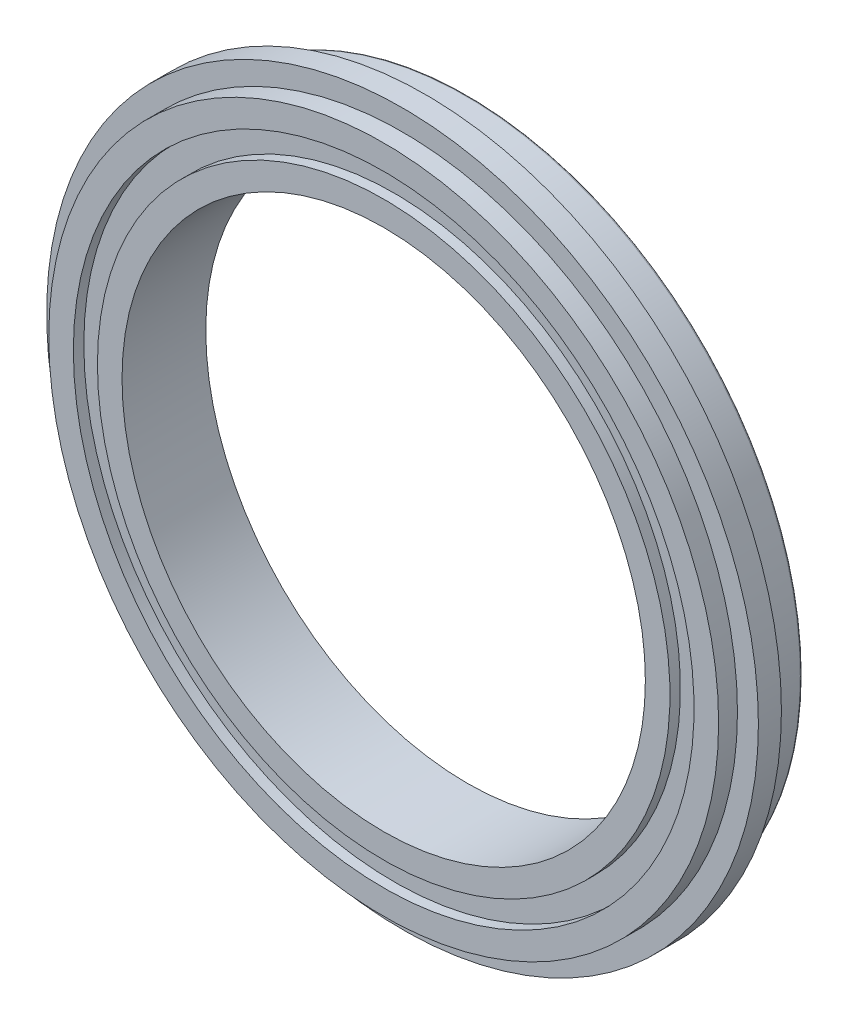
ISO-10303-21;
HEADER;
FILE_DESCRIPTION(('STEP AP214'),'2;1');
FILE_NAME('part.step','',(''),(''),'','','');
FILE_SCHEMA(('AUTOMOTIVE_DESIGN { 1 0 10303 214 1 1 1 1 }'));
ENDSEC;
DATA;
#1=APPLICATION_CONTEXT('core data for automotive mechanical design processes');
#2=APPLICATION_PROTOCOL_DEFINITION('international standard','automotive_design',2000,#1);
#3=PRODUCT_CONTEXT('',#1,'mechanical');
#4=PRODUCT('Part','Part','',(#3));
#5=PRODUCT_RELATED_PRODUCT_CATEGORY('part','',(#4));
#6=PRODUCT_DEFINITION_FORMATION('','',#4);
#7=PRODUCT_DEFINITION_CONTEXT('part definition',#1,'design');
#8=PRODUCT_DEFINITION('design','',#6,#7);
#9=PRODUCT_DEFINITION_SHAPE('','',#8);
#10=(LENGTH_UNIT() NAMED_UNIT(*) SI_UNIT(.MILLI.,.METRE.));
#11=(NAMED_UNIT(*) PLANE_ANGLE_UNIT() SI_UNIT($,.RADIAN.));
#12=(NAMED_UNIT(*) SI_UNIT($,.STERADIAN.) SOLID_ANGLE_UNIT());
#13=UNCERTAINTY_MEASURE_WITH_UNIT(LENGTH_MEASURE(1.E-05),#10,'distance_accuracy_value','');
#14=(GEOMETRIC_REPRESENTATION_CONTEXT(3) GLOBAL_UNCERTAINTY_ASSIGNED_CONTEXT((#13)) GLOBAL_UNIT_ASSIGNED_CONTEXT((#10,
#11,#12)) REPRESENTATION_CONTEXT('',''));
#15=CARTESIAN_POINT('',(0.,0.,0.));
#16=DIRECTION('',(0.,0.,1.));
#17=DIRECTION('',(1.,0.,0.));
#18=AXIS2_PLACEMENT_3D('',#15,#16,#17);
#19=CARTESIAN_POINT('',(0.,0.,4.));
#20=DIRECTION('',(0.,0.,1.));
#21=DIRECTION('',(1.,0.,0.));
#22=AXIS2_PLACEMENT_3D('',#19,#20,#21);
#23=PLANE('',#22);
#24=CARTESIAN_POINT('',(0.,0.,4.));
#25=DIRECTION('',(0.,0.,-1.));
#26=DIRECTION('',(-1.,0.,0.));
#27=AXIS2_PLACEMENT_3D('',#24,#25,#26);
#28=CIRCLE('',#27,13.675);
#29=CARTESIAN_POINT('',(-13.675,0.,4.));
#30=VERTEX_POINT('',#29);
#31=EDGE_CURVE('E81',#30,#30,#28,.T.);
#32=ORIENTED_EDGE('',*,*,#31,.F.);
#33=EDGE_LOOP('',(#32));
#34=FACE_BOUND('',#33,.T.);
#35=CARTESIAN_POINT('',(0.,0.,4.));
#36=DIRECTION('',(0.,0.,1.));
#37=DIRECTION('',(1.,0.,0.));
#38=AXIS2_PLACEMENT_3D('',#35,#36,#37);
#39=CIRCLE('',#38,12.5);
#40=CARTESIAN_POINT('',(12.5,0.,4.));
#41=VERTEX_POINT('',#40);
#42=EDGE_CURVE('E52',#41,#41,#39,.T.);
#43=ORIENTED_EDGE('',*,*,#42,.F.);
#44=EDGE_LOOP('',(#43));
#45=FACE_BOUND('',#44,.T.);
#46=ADVANCED_FACE('F32',(#34,#45),#23,.T.);
#47=CARTESIAN_POINT('',(0.,0.,0.));
#48=DIRECTION('',(0.,0.,1.));
#49=DIRECTION('',(1.,0.,0.));
#50=AXIS2_PLACEMENT_3D('',#47,#48,#49);
#51=PLANE('',#50);
#52=CARTESIAN_POINT('',(0.,0.,0.));
#53=DIRECTION('',(0.,0.,-1.));
#54=DIRECTION('',(-1.,0.,0.));
#55=AXIS2_PLACEMENT_3D('',#52,#53,#54);
#56=CIRCLE('',#55,13.675);
#57=CARTESIAN_POINT('',(-13.675,0.,0.));
#58=VERTEX_POINT('',#57);
#59=EDGE_CURVE('E67',#58,#58,#56,.T.);
#60=ORIENTED_EDGE('',*,*,#59,.T.);
#61=EDGE_LOOP('',(#60));
#62=FACE_BOUND('',#61,.T.);
#63=CARTESIAN_POINT('',(0.,0.,0.));
#64=DIRECTION('',(0.,0.,1.));
#65=DIRECTION('',(1.,0.,0.));
#66=AXIS2_PLACEMENT_3D('',#63,#64,#65);
#67=CIRCLE('',#66,12.5);
#68=CARTESIAN_POINT('',(12.5,0.,0.));
#69=VERTEX_POINT('',#68);
#70=EDGE_CURVE('E53',#69,#69,#67,.T.);
#71=ORIENTED_EDGE('',*,*,#70,.T.);
#72=EDGE_LOOP('',(#71));
#73=FACE_BOUND('',#72,.T.);
#74=ADVANCED_FACE('F132',(#62,#73),#51,.F.);
#75=CARTESIAN_POINT('',(0.,0.,4.));
#76=DIRECTION('',(0.,0.,-1.));
#77=DIRECTION('',(-1.,0.,0.));
#78=AXIS2_PLACEMENT_3D('',#75,#76,#77);
#79=CYLINDRICAL_SURFACE('',#78,16.);
#80=CARTESIAN_POINT('',(0.,0.,0.0999999999999998));
#81=DIRECTION('',(0.,0.,1.));
#82=DIRECTION('',(1.,0.,0.));
#83=AXIS2_PLACEMENT_3D('',#80,#81,#82);
#84=CIRCLE('',#83,16.);
#85=CARTESIAN_POINT('',(16.,0.,0.0999999999999998));
#86=VERTEX_POINT('',#85);
#87=EDGE_CURVE('E39',#86,#86,#84,.T.);
#88=ORIENTED_EDGE('',*,*,#87,.T.);
#89=EDGE_LOOP('',(#88));
#90=FACE_BOUND('',#89,.T.);
#91=CARTESIAN_POINT('',(0.,0.,2.));
#92=DIRECTION('',(0.,0.,1.));
#93=DIRECTION('',(1.,0.,0.));
#94=AXIS2_PLACEMENT_3D('',#91,#92,#93);
#95=CIRCLE('',#94,16.);
#96=CARTESIAN_POINT('',(16.,0.,2.));
#97=VERTEX_POINT('',#96);
#98=EDGE_CURVE('E43',#97,#97,#95,.T.);
#99=ORIENTED_EDGE('',*,*,#98,.F.);
#100=EDGE_LOOP('',(#99));
#101=FACE_BOUND('',#100,.T.);
#102=ADVANCED_FACE('F138',(#90,#101),#79,.T.);
#103=CARTESIAN_POINT('',(0.,0.,4.));
#104=DIRECTION('',(0.,0.,-1.));
#105=DIRECTION('',(-1.,0.,0.));
#106=AXIS2_PLACEMENT_3D('',#103,#104,#105);
#107=CIRCLE('',#106,14.825);
#108=CARTESIAN_POINT('',(-14.825,0.,4.));
#109=VERTEX_POINT('',#108);
#110=EDGE_CURVE('E95',#109,#109,#107,.T.);
#111=ORIENTED_EDGE('',*,*,#110,.T.);
#112=EDGE_LOOP('',(#111));
#113=FACE_BOUND('',#112,.T.);
#114=CARTESIAN_POINT('',(0.,0.,4.));
#115=DIRECTION('',(0.,0.,1.));
#116=DIRECTION('',(1.,0.,0.));
#117=AXIS2_PLACEMENT_3D('',#114,#115,#116);
#118=CIRCLE('',#117,16.);
#119=CARTESIAN_POINT('',(16.,0.,4.));
#120=VERTEX_POINT('',#119);
#121=EDGE_CURVE('E47',#120,#120,#118,.T.);
#122=ORIENTED_EDGE('',*,*,#121,.T.);
#123=EDGE_LOOP('',(#122));
#124=FACE_BOUND('',#123,.T.);
#125=ADVANCED_FACE('F116',(#113,#124),#23,.T.);
#126=CARTESIAN_POINT('',(0.,0.,0.));
#127=DIRECTION('',(0.,0.,-1.));
#128=DIRECTION('',(-1.,0.,0.));
#129=AXIS2_PLACEMENT_3D('',#126,#127,#128);
#130=CIRCLE('',#129,14.825);
#131=CARTESIAN_POINT('',(-14.825,0.,0.));
#132=VERTEX_POINT('',#131);
#133=EDGE_CURVE('E71',#132,#132,#130,.T.);
#134=ORIENTED_EDGE('',*,*,#133,.F.);
#135=EDGE_LOOP('',(#134));
#136=FACE_BOUND('',#135,.T.);
#137=CARTESIAN_POINT('',(0.,0.,0.));
#138=DIRECTION('',(0.,0.,1.));
#139=DIRECTION('',(1.,0.,0.));
#140=AXIS2_PLACEMENT_3D('',#137,#138,#139);
#141=CIRCLE('',#140,15.9);
#142=CARTESIAN_POINT('',(15.9,0.,0.));
#143=VERTEX_POINT('',#142);
#144=EDGE_CURVE('E10',#143,#143,#141,.F.);
#145=ORIENTED_EDGE('',*,*,#144,.T.);
#146=EDGE_LOOP('',(#145));
#147=FACE_BOUND('',#146,.T.);
#148=ADVANCED_FACE('F141',(#136,#147),#51,.F.);
#149=CARTESIAN_POINT('',(0.,0.,3.1));
#150=DIRECTION('',(0.,0.,1.));
#151=DIRECTION('',(1.,0.,0.));
#152=AXIS2_PLACEMENT_3D('',#149,#150,#151);
#153=CIRCLE('',#152,16.);
#154=CARTESIAN_POINT('',(16.,0.,3.1));
#155=VERTEX_POINT('',#154);
#156=EDGE_CURVE('E62',#155,#155,#153,.T.);
#157=ORIENTED_EDGE('',*,*,#156,.T.);
#158=EDGE_LOOP('',(#157));
#159=FACE_BOUND('',#158,.T.);
#160=ORIENTED_EDGE('',*,*,#121,.F.);
#161=EDGE_LOOP('',(#160));
#162=FACE_BOUND('',#161,.T.);
#163=ADVANCED_FACE('F150',(#159,#162),#79,.T.);
#164=CARTESIAN_POINT('',(0.,0.,4.));
#165=DIRECTION('',(0.,0.,-1.));
#166=DIRECTION('',(-1.,0.,0.));
#167=AXIS2_PLACEMENT_3D('',#164,#165,#166);
#168=CYLINDRICAL_SURFACE('',#167,12.5);
#169=ORIENTED_EDGE('',*,*,#42,.T.);
#170=EDGE_LOOP('',(#169));
#171=FACE_BOUND('',#170,.T.);
#172=ORIENTED_EDGE('',*,*,#70,.F.);
#173=EDGE_LOOP('',(#172));
#174=FACE_BOUND('',#173,.T.);
#175=ADVANCED_FACE('F156',(#171,#174),#168,.F.);
#176=CARTESIAN_POINT('',(0.,0.,2.));
#177=DIRECTION('',(0.,0.,1.));
#178=DIRECTION('',(1.,0.,0.));
#179=AXIS2_PLACEMENT_3D('',#176,#177,#178);
#180=CYLINDRICAL_SURFACE('',#179,17.);
#181=CARTESIAN_POINT('',(0.,0.,2.));
#182=DIRECTION('',(0.,0.,1.));
#183=DIRECTION('',(1.,0.,0.));
#184=AXIS2_PLACEMENT_3D('',#181,#182,#183);
#185=CIRCLE('',#184,17.);
#186=CARTESIAN_POINT('',(17.,0.,2.));
#187=VERTEX_POINT('',#186);
#188=EDGE_CURVE('E56',#187,#187,#185,.T.);
#189=ORIENTED_EDGE('',*,*,#188,.T.);
#190=EDGE_LOOP('',(#189));
#191=FACE_BOUND('',#190,.T.);
#192=CARTESIAN_POINT('',(0.,0.,3.1));
#193=DIRECTION('',(0.,0.,1.));
#194=DIRECTION('',(1.,0.,0.));
#195=AXIS2_PLACEMENT_3D('',#192,#193,#194);
#196=CIRCLE('',#195,17.);
#197=CARTESIAN_POINT('',(17.,0.,3.1));
#198=VERTEX_POINT('',#197);
#199=EDGE_CURVE('E59',#198,#198,#196,.T.);
#200=ORIENTED_EDGE('',*,*,#199,.F.);
#201=EDGE_LOOP('',(#200));
#202=FACE_BOUND('',#201,.T.);
#203=ADVANCED_FACE('F161',(#191,#202),#180,.T.);
#204=CARTESIAN_POINT('',(0.,0.,2.));
#205=DIRECTION('',(0.,0.,1.));
#206=DIRECTION('',(1.,0.,0.));
#207=AXIS2_PLACEMENT_3D('',#204,#205,#206);
#208=PLANE('',#207);
#209=ORIENTED_EDGE('',*,*,#98,.T.);
#210=EDGE_LOOP('',(#209));
#211=FACE_BOUND('',#210,.T.);
#212=ORIENTED_EDGE('',*,*,#188,.F.);
#213=EDGE_LOOP('',(#212));
#214=FACE_BOUND('',#213,.T.);
#215=ADVANCED_FACE('F170',(#211,#214),#208,.F.);
#216=CARTESIAN_POINT('',(0.,0.,3.1));
#217=DIRECTION('',(0.,0.,1.));
#218=DIRECTION('',(1.,0.,0.));
#219=AXIS2_PLACEMENT_3D('',#216,#217,#218);
#220=PLANE('',#219);
#221=ORIENTED_EDGE('',*,*,#156,.F.);
#222=EDGE_LOOP('',(#221));
#223=FACE_BOUND('',#222,.T.);
#224=ORIENTED_EDGE('',*,*,#199,.T.);
#225=EDGE_LOOP('',(#224));
#226=FACE_BOUND('',#225,.T.);
#227=ADVANCED_FACE('F167',(#223,#226),#220,.T.);
#228=CARTESIAN_POINT('',(0.,0.,0.0999999999999998));
#229=DIRECTION('',(0.,0.,1.));
#230=DIRECTION('',(1.,0.,0.));
#231=AXIS2_PLACEMENT_3D('',#228,#229,#230);
#232=TOROIDAL_SURFACE('',#231,15.9,0.1);
#233=ORIENTED_EDGE('',*,*,#144,.F.);
#234=EDGE_LOOP('',(#233));
#235=FACE_BOUND('',#234,.T.);
#236=ORIENTED_EDGE('',*,*,#87,.F.);
#237=EDGE_LOOP('',(#236));
#238=FACE_BOUND('',#237,.T.);
#239=ADVANCED_FACE('F34',(#235,#238),#232,.T.);
#240=CARTESIAN_POINT('',(0.,0.,0.));
#241=DIRECTION('',(0.,0.,-1.));
#242=DIRECTION('',(-1.,0.,0.));
#243=AXIS2_PLACEMENT_3D('',#240,#241,#242);
#244=CYLINDRICAL_SURFACE('',#243,13.675);
#245=ORIENTED_EDGE('',*,*,#59,.F.);
#246=EDGE_LOOP('',(#245));
#247=FACE_BOUND('',#246,.T.);
#248=CARTESIAN_POINT('',(0.,0.,0.5));
#249=DIRECTION('',(0.,0.,-1.));
#250=DIRECTION('',(-1.,0.,0.));
#251=AXIS2_PLACEMENT_3D('',#248,#249,#250);
#252=CIRCLE('',#251,13.675);
#253=CARTESIAN_POINT('',(-13.675,0.,0.5));
#254=VERTEX_POINT('',#253);
#255=EDGE_CURVE('E84',#254,#254,#252,.T.);
#256=ORIENTED_EDGE('',*,*,#255,.T.);
#257=EDGE_LOOP('',(#256));
#258=FACE_BOUND('',#257,.T.);
#259=ADVANCED_FACE('F199',(#247,#258),#244,.T.);
#260=CARTESIAN_POINT('',(0.,13.675,0.5));
#261=DIRECTION('',(0.,0.,1.));
#262=DIRECTION('',(1.,0.,0.));
#263=AXIS2_PLACEMENT_3D('',#260,#261,#262);
#264=PLANE('',#263);
#265=ORIENTED_EDGE('',*,*,#255,.F.);
#266=EDGE_LOOP('',(#265));
#267=FACE_BOUND('',#266,.T.);
#268=CARTESIAN_POINT('',(0.,0.,0.5));
#269=DIRECTION('',(0.,0.,-1.));
#270=DIRECTION('',(-1.,0.,0.));
#271=AXIS2_PLACEMENT_3D('',#268,#269,#270);
#272=CIRCLE('',#271,14.825);
#273=CARTESIAN_POINT('',(-14.825,0.,0.5));
#274=VERTEX_POINT('',#273);
#275=EDGE_CURVE('E87',#274,#274,#272,.T.);
#276=ORIENTED_EDGE('',*,*,#275,.T.);
#277=EDGE_LOOP('',(#276));
#278=FACE_BOUND('',#277,.T.);
#279=ADVANCED_FACE('F202',(#267,#278),#264,.F.);
#280=CARTESIAN_POINT('',(0.,0.,0.));
#281=DIRECTION('',(0.,0.,-1.));
#282=DIRECTION('',(-1.,0.,0.));
#283=AXIS2_PLACEMENT_3D('',#280,#281,#282);
#284=CYLINDRICAL_SURFACE('',#283,14.825);
#285=ORIENTED_EDGE('',*,*,#275,.F.);
#286=EDGE_LOOP('',(#285));
#287=FACE_BOUND('',#286,.T.);
#288=ORIENTED_EDGE('',*,*,#133,.T.);
#289=EDGE_LOOP('',(#288));
#290=FACE_BOUND('',#289,.T.);
#291=ADVANCED_FACE('F206',(#287,#290),#284,.F.);
#292=CARTESIAN_POINT('',(0.,0.,4.));
#293=DIRECTION('',(0.,0.,1.));
#294=DIRECTION('',(-1.,0.,0.));
#295=AXIS2_PLACEMENT_3D('',#292,#293,#294);
#296=CYLINDRICAL_SURFACE('',#295,13.675);
#297=ORIENTED_EDGE('',*,*,#31,.T.);
#298=EDGE_LOOP('',(#297));
#299=FACE_BOUND('',#298,.T.);
#300=CARTESIAN_POINT('',(0.,0.,3.5));
#301=DIRECTION('',(0.,0.,-1.));
#302=DIRECTION('',(-1.,0.,0.));
#303=AXIS2_PLACEMENT_3D('',#300,#301,#302);
#304=CIRCLE('',#303,13.675);
#305=CARTESIAN_POINT('',(-13.675,0.,3.5));
#306=VERTEX_POINT('',#305);
#307=EDGE_CURVE('E107',#306,#306,#304,.T.);
#308=ORIENTED_EDGE('',*,*,#307,.F.);
#309=EDGE_LOOP('',(#308));
#310=FACE_BOUND('',#309,.T.);
#311=ADVANCED_FACE('F128',(#299,#310),#296,.T.);
#312=CARTESIAN_POINT('',(0.,13.675,3.5));
#313=DIRECTION('',(0.,0.,-1.));
#314=DIRECTION('',(1.,0.,0.));
#315=AXIS2_PLACEMENT_3D('',#312,#313,#314);
#316=PLANE('',#315);
#317=ORIENTED_EDGE('',*,*,#307,.T.);
#318=EDGE_LOOP('',(#317));
#319=FACE_BOUND('',#318,.T.);
#320=CARTESIAN_POINT('',(0.,0.,3.5));
#321=DIRECTION('',(0.,0.,-1.));
#322=DIRECTION('',(-1.,0.,0.));
#323=AXIS2_PLACEMENT_3D('',#320,#321,#322);
#324=CIRCLE('',#323,14.825);
#325=CARTESIAN_POINT('',(-14.825,0.,3.5));
#326=VERTEX_POINT('',#325);
#327=EDGE_CURVE('E110',#326,#326,#324,.T.);
#328=ORIENTED_EDGE('',*,*,#327,.F.);
#329=EDGE_LOOP('',(#328));
#330=FACE_BOUND('',#329,.T.);
#331=ADVANCED_FACE('F121',(#319,#330),#316,.F.);
#332=CARTESIAN_POINT('',(0.,0.,4.));
#333=DIRECTION('',(0.,0.,1.));
#334=DIRECTION('',(-1.,0.,0.));
#335=AXIS2_PLACEMENT_3D('',#332,#333,#334);
#336=CYLINDRICAL_SURFACE('',#335,14.825);
#337=ORIENTED_EDGE('',*,*,#327,.T.);
#338=EDGE_LOOP('',(#337));
#339=FACE_BOUND('',#338,.T.);
#340=ORIENTED_EDGE('',*,*,#110,.F.);
#341=EDGE_LOOP('',(#340));
#342=FACE_BOUND('',#341,.T.);
#343=ADVANCED_FACE('F119',(#339,#342),#336,.F.);
#344=CLOSED_SHELL('',(#46,#74,#102,#125,#148,#163,#175,#203,#215,#227,#239,#259,#279,#291,#311,
#331,#343));
#345=CARTESIAN_POINT('',(0.,13.675,3.1));
#346=DIRECTION('',(0.,0.,1.));
#347=DIRECTION('',(1.,0.,0.));
#348=AXIS2_PLACEMENT_3D('',#345,#346,#347);
#349=PLANE('',#348);
#350=CARTESIAN_POINT('',(0.,0.,3.1));
#351=DIRECTION('',(0.,0.,-1.));
#352=DIRECTION('',(-1.,0.,0.));
#353=AXIS2_PLACEMENT_3D('',#350,#351,#352);
#354=CIRCLE('',#353,13.675);
#355=CARTESIAN_POINT('',(-13.675,0.,3.1));
#356=VERTEX_POINT('',#355);
#357=EDGE_CURVE('E68',#356,#356,#354,.T.);
#358=ORIENTED_EDGE('',*,*,#357,.F.);
#359=EDGE_LOOP('',(#358));
#360=FACE_BOUND('',#359,.T.);
#361=CARTESIAN_POINT('',(0.,0.,3.1));
#362=DIRECTION('',(0.,0.,-1.));
#363=DIRECTION('',(-1.,0.,0.));
#364=AXIS2_PLACEMENT_3D('',#361,#362,#363);
#365=CIRCLE('',#364,14.825);
#366=CARTESIAN_POINT('',(-14.825,0.,3.1));
#367=VERTEX_POINT('',#366);
#368=EDGE_CURVE('E78',#367,#367,#365,.T.);
#369=ORIENTED_EDGE('',*,*,#368,.T.);
#370=EDGE_LOOP('',(#369));
#371=FACE_BOUND('',#370,.T.);
#372=ADVANCED_FACE('F183',(#360,#371),#349,.F.);
#373=CARTESIAN_POINT('',(0.,0.,0.));
#374=DIRECTION('',(0.,0.,-1.));
#375=DIRECTION('',(-1.,0.,0.));
#376=AXIS2_PLACEMENT_3D('',#373,#374,#375);
#377=CYLINDRICAL_SURFACE('',#376,13.675);
#378=CARTESIAN_POINT('',(0.,0.,2.6));
#379=DIRECTION('',(0.,0.,-1.));
#380=DIRECTION('',(-1.,0.,0.));
#381=AXIS2_PLACEMENT_3D('',#378,#379,#380);
#382=CIRCLE('',#381,13.675);
#383=CARTESIAN_POINT('',(-13.675,0.,2.6));
#384=VERTEX_POINT('',#383);
#385=EDGE_CURVE('E72',#384,#384,#382,.T.);
#386=ORIENTED_EDGE('',*,*,#385,.F.);
#387=EDGE_LOOP('',(#386));
#388=FACE_BOUND('',#387,.T.);
#389=ORIENTED_EDGE('',*,*,#357,.T.);
#390=EDGE_LOOP('',(#389));
#391=FACE_BOUND('',#390,.T.);
#392=ADVANCED_FACE('F185',(#388,#391),#377,.T.);
#393=CARTESIAN_POINT('',(0.,13.675,2.6));
#394=DIRECTION('',(0.,0.,-1.));
#395=DIRECTION('',(-1.,0.,0.));
#396=AXIS2_PLACEMENT_3D('',#393,#394,#395);
#397=PLANE('',#396);
#398=CARTESIAN_POINT('',(0.,0.,2.6));
#399=DIRECTION('',(0.,0.,-1.));
#400=DIRECTION('',(-1.,0.,0.));
#401=AXIS2_PLACEMENT_3D('',#398,#399,#400);
#402=CIRCLE('',#401,14.825);
#403=CARTESIAN_POINT('',(-14.825,0.,2.6));
#404=VERTEX_POINT('',#403);
#405=EDGE_CURVE('E75',#404,#404,#402,.T.);
#406=ORIENTED_EDGE('',*,*,#405,.F.);
#407=EDGE_LOOP('',(#406));
#408=FACE_BOUND('',#407,.T.);
#409=ORIENTED_EDGE('',*,*,#385,.T.);
#410=EDGE_LOOP('',(#409));
#411=FACE_BOUND('',#410,.T.);
#412=ADVANCED_FACE('F190',(#408,#411),#397,.F.);
#413=CARTESIAN_POINT('',(0.,0.,0.));
#414=DIRECTION('',(0.,0.,-1.));
#415=DIRECTION('',(-1.,0.,0.));
#416=AXIS2_PLACEMENT_3D('',#413,#414,#415);
#417=CYLINDRICAL_SURFACE('',#416,14.825);
#418=ORIENTED_EDGE('',*,*,#368,.F.);
#419=EDGE_LOOP('',(#418));
#420=FACE_BOUND('',#419,.T.);
#421=ORIENTED_EDGE('',*,*,#405,.T.);
#422=EDGE_LOOP('',(#421));
#423=FACE_BOUND('',#422,.T.);
#424=ADVANCED_FACE('F194',(#420,#423),#417,.F.);
#425=CLOSED_SHELL('',(#372,#392,#412,#424));
#426=CARTESIAN_POINT('',(0.,13.675,0.9));
#427=DIRECTION('',(0.,0.,-1.));
#428=DIRECTION('',(1.,0.,0.));
#429=AXIS2_PLACEMENT_3D('',#426,#427,#428);
#430=PLANE('',#429);
#431=CARTESIAN_POINT('',(0.,0.,0.9));
#432=DIRECTION('',(0.,0.,-1.));
#433=DIRECTION('',(-1.,0.,0.));
#434=AXIS2_PLACEMENT_3D('',#431,#432,#433);
#435=CIRCLE('',#434,13.675);
#436=CARTESIAN_POINT('',(-13.675,0.,0.9));
#437=VERTEX_POINT('',#436);
#438=EDGE_CURVE('E92',#437,#437,#435,.T.);
#439=ORIENTED_EDGE('',*,*,#438,.T.);
#440=EDGE_LOOP('',(#439));
#441=FACE_BOUND('',#440,.T.);
#442=CARTESIAN_POINT('',(0.,0.,0.9));
#443=DIRECTION('',(0.,0.,-1.));
#444=DIRECTION('',(-1.,0.,0.));
#445=AXIS2_PLACEMENT_3D('',#442,#443,#444);
#446=CIRCLE('',#445,14.825);
#447=CARTESIAN_POINT('',(-14.825,0.,0.9));
#448=VERTEX_POINT('',#447);
#449=EDGE_CURVE('E102',#448,#448,#446,.T.);
#450=ORIENTED_EDGE('',*,*,#449,.F.);
#451=EDGE_LOOP('',(#450));
#452=FACE_BOUND('',#451,.T.);
#453=ADVANCED_FACE('F211',(#441,#452),#430,.F.);
#454=CARTESIAN_POINT('',(0.,0.,4.));
#455=DIRECTION('',(0.,0.,1.));
#456=DIRECTION('',(-1.,0.,0.));
#457=AXIS2_PLACEMENT_3D('',#454,#455,#456);
#458=CYLINDRICAL_SURFACE('',#457,13.675);
#459=CARTESIAN_POINT('',(0.,0.,1.4));
#460=DIRECTION('',(0.,0.,-1.));
#461=DIRECTION('',(-1.,0.,0.));
#462=AXIS2_PLACEMENT_3D('',#459,#460,#461);
#463=CIRCLE('',#462,13.675);
#464=CARTESIAN_POINT('',(-13.675,0.,1.4));
#465=VERTEX_POINT('',#464);
#466=EDGE_CURVE('E96',#465,#465,#463,.T.);
#467=ORIENTED_EDGE('',*,*,#466,.T.);
#468=EDGE_LOOP('',(#467));
#469=FACE_BOUND('',#468,.T.);
#470=ORIENTED_EDGE('',*,*,#438,.F.);
#471=EDGE_LOOP('',(#470));
#472=FACE_BOUND('',#471,.T.);
#473=ADVANCED_FACE('F214',(#469,#472),#458,.T.);
#474=CARTESIAN_POINT('',(0.,13.675,1.4));
#475=DIRECTION('',(0.,0.,1.));
#476=DIRECTION('',(-1.,0.,0.));
#477=AXIS2_PLACEMENT_3D('',#474,#475,#476);
#478=PLANE('',#477);
#479=CARTESIAN_POINT('',(0.,0.,1.4));
#480=DIRECTION('',(0.,0.,-1.));
#481=DIRECTION('',(-1.,0.,0.));
#482=AXIS2_PLACEMENT_3D('',#479,#480,#481);
#483=CIRCLE('',#482,14.825);
#484=CARTESIAN_POINT('',(-14.825,0.,1.4));
#485=VERTEX_POINT('',#484);
#486=EDGE_CURVE('E99',#485,#485,#483,.T.);
#487=ORIENTED_EDGE('',*,*,#486,.T.);
#488=EDGE_LOOP('',(#487));
#489=FACE_BOUND('',#488,.T.);
#490=ORIENTED_EDGE('',*,*,#466,.F.);
#491=EDGE_LOOP('',(#490));
#492=FACE_BOUND('',#491,.T.);
#493=ADVANCED_FACE('F220',(#489,#492),#478,.F.);
#494=CARTESIAN_POINT('',(0.,0.,4.));
#495=DIRECTION('',(0.,0.,1.));
#496=DIRECTION('',(-1.,0.,0.));
#497=AXIS2_PLACEMENT_3D('',#494,#495,#496);
#498=CYLINDRICAL_SURFACE('',#497,14.825);
#499=ORIENTED_EDGE('',*,*,#449,.T.);
#500=EDGE_LOOP('',(#499));
#501=FACE_BOUND('',#500,.T.);
#502=ORIENTED_EDGE('',*,*,#486,.F.);
#503=EDGE_LOOP('',(#502));
#504=FACE_BOUND('',#503,.T.);
#505=ADVANCED_FACE('F224',(#501,#504),#498,.F.);
#506=CLOSED_SHELL('',(#453,#473,#493,#505));
#507=ORIENTED_CLOSED_SHELL('',*,#425,.T.);
#508=ORIENTED_CLOSED_SHELL('',*,#506,.T.);
#509=BREP_WITH_VOIDS('B2',#344,(#507,#508));
#510=ADVANCED_BREP_SHAPE_REPRESENTATION('',(#18,#509),#14);
#511=SHAPE_DEFINITION_REPRESENTATION(#9,#510);
ENDSEC;
END-ISO-10303-21;
